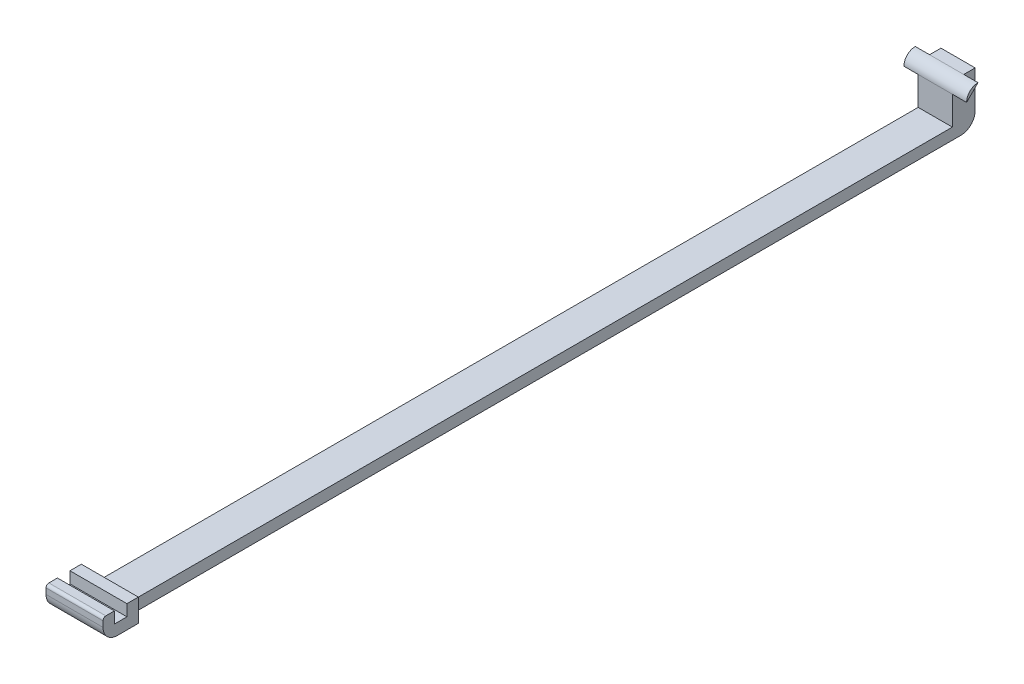
ISO-10303-21;
HEADER;
FILE_DESCRIPTION(('STEP AP214'),'2;1');
FILE_NAME('part.step','',(''),(''),'','','');
FILE_SCHEMA(('AUTOMOTIVE_DESIGN { 1 0 10303 214 1 1 1 1 }'));
ENDSEC;
DATA;
#1=APPLICATION_CONTEXT('core data for automotive mechanical design processes');
#2=APPLICATION_PROTOCOL_DEFINITION('international standard','automotive_design',2000,#1);
#3=PRODUCT_CONTEXT('',#1,'mechanical');
#4=PRODUCT('Part','Part','',(#3));
#5=PRODUCT_RELATED_PRODUCT_CATEGORY('part','',(#4));
#6=PRODUCT_DEFINITION_FORMATION('','',#4);
#7=PRODUCT_DEFINITION_CONTEXT('part definition',#1,'design');
#8=PRODUCT_DEFINITION('design','',#6,#7);
#9=PRODUCT_DEFINITION_SHAPE('','',#8);
#10=(LENGTH_UNIT() NAMED_UNIT(*) SI_UNIT(.MILLI.,.METRE.));
#11=(NAMED_UNIT(*) PLANE_ANGLE_UNIT() SI_UNIT($,.RADIAN.));
#12=(NAMED_UNIT(*) SI_UNIT($,.STERADIAN.) SOLID_ANGLE_UNIT());
#13=UNCERTAINTY_MEASURE_WITH_UNIT(LENGTH_MEASURE(1.E-05),#10,'distance_accuracy_value','');
#14=(GEOMETRIC_REPRESENTATION_CONTEXT(3) GLOBAL_UNCERTAINTY_ASSIGNED_CONTEXT((#13)) GLOBAL_UNIT_ASSIGNED_CONTEXT((#10,
#11,#12)) REPRESENTATION_CONTEXT('',''));
#15=CARTESIAN_POINT('',(0.,0.,0.));
#16=DIRECTION('',(0.,0.,1.));
#17=DIRECTION('',(1.,0.,0.));
#18=AXIS2_PLACEMENT_3D('',#15,#16,#17);
#19=CARTESIAN_POINT('',(-17.5,42.8284271247462,75.5));
#20=DIRECTION('',(0.,0.,1.));
#21=DIRECTION('',(1.,0.,0.));
#22=AXIS2_PLACEMENT_3D('',#19,#20,#21);
#23=PLANE('',#22);
#24=DIRECTION('',(0.,1.,0.));
#25=VECTOR('',#24,1.);
#26=CARTESIAN_POINT('',(5.00000000000003,42.8284271247462,75.5));
#27=LINE('',#26,#25);
#28=CARTESIAN_POINT('',(5.00000000000003,2.,75.5));
#29=VERTEX_POINT('',#28);
#30=CARTESIAN_POINT('',(5.00000000000003,4.,75.5));
#31=VERTEX_POINT('',#30);
#32=EDGE_CURVE('E338',#29,#31,#27,.T.);
#33=ORIENTED_EDGE('',*,*,#32,.F.);
#34=DIRECTION('',(-1.,0.,0.));
#35=VECTOR('',#34,1.);
#36=CARTESIAN_POINT('',(-17.5,2.,75.5));
#37=LINE('',#36,#35);
#38=CARTESIAN_POINT('',(-5.,2.,75.5));
#39=VERTEX_POINT('',#38);
#40=EDGE_CURVE('E369',#29,#39,#37,.T.);
#41=ORIENTED_EDGE('',*,*,#40,.T.);
#42=DIRECTION('',(0.,1.,0.));
#43=VECTOR('',#42,1.);
#44=CARTESIAN_POINT('',(-5.,42.8284271247462,75.5));
#45=LINE('',#44,#43);
#46=CARTESIAN_POINT('',(-5.,4.,75.5));
#47=VERTEX_POINT('',#46);
#48=EDGE_CURVE('E317',#39,#47,#45,.T.);
#49=ORIENTED_EDGE('',*,*,#48,.T.);
#50=DIRECTION('',(-1.,0.,0.));
#51=VECTOR('',#50,1.);
#52=CARTESIAN_POINT('',(-15.5,4.,75.5));
#53=LINE('',#52,#51);
#54=EDGE_CURVE('E362',#31,#47,#53,.T.);
#55=ORIENTED_EDGE('',*,*,#54,.F.);
#56=EDGE_LOOP('',(#33,#41,#49,#55));
#57=FACE_BOUND('',#56,.T.);
#58=ADVANCED_FACE('F84',(#57),#23,.F.);
#59=CARTESIAN_POINT('',(-17.5,42.8284271247462,73.3));
#60=DIRECTION('',(0.,0.,-1.));
#61=DIRECTION('',(-1.,0.,0.));
#62=AXIS2_PLACEMENT_3D('',#59,#60,#61);
#63=PLANE('',#62);
#64=DIRECTION('',(0.,-1.,0.));
#65=VECTOR('',#64,1.);
#66=CARTESIAN_POINT('',(5.00000000000003,42.8284271247462,73.3000000000001));
#67=LINE('',#66,#65);
#68=CARTESIAN_POINT('',(5.00000000000003,4.,73.3000000000001));
#69=VERTEX_POINT('',#68);
#70=CARTESIAN_POINT('',(5.00000000000003,2.,73.3));
#71=VERTEX_POINT('',#70);
#72=EDGE_CURVE('E103',#69,#71,#67,.T.);
#73=ORIENTED_EDGE('',*,*,#72,.F.);
#74=DIRECTION('',(1.,0.,0.));
#75=VECTOR('',#74,1.);
#76=CARTESIAN_POINT('',(-15.5,4.,73.3));
#77=LINE('',#76,#75);
#78=CARTESIAN_POINT('',(-5.,4.,73.3000000000001));
#79=VERTEX_POINT('',#78);
#80=EDGE_CURVE('E356',#79,#69,#77,.T.);
#81=ORIENTED_EDGE('',*,*,#80,.F.);
#82=DIRECTION('',(0.,-1.,0.));
#83=VECTOR('',#82,1.);
#84=CARTESIAN_POINT('',(-5.,42.8284271247462,73.3000000000001));
#85=LINE('',#84,#83);
#86=CARTESIAN_POINT('',(-5.,2.,73.3));
#87=VERTEX_POINT('',#86);
#88=EDGE_CURVE('E322',#79,#87,#85,.T.);
#89=ORIENTED_EDGE('',*,*,#88,.T.);
#90=DIRECTION('',(1.,0.,0.));
#91=VECTOR('',#90,1.);
#92=CARTESIAN_POINT('',(-17.5,2.,73.3));
#93=LINE('',#92,#91);
#94=EDGE_CURVE('E365',#87,#71,#93,.T.);
#95=ORIENTED_EDGE('',*,*,#94,.T.);
#96=EDGE_LOOP('',(#73,#81,#89,#95));
#97=FACE_BOUND('',#96,.T.);
#98=ADVANCED_FACE('F452',(#97),#63,.F.);
#99=CARTESIAN_POINT('',(0.,2.,0.));
#100=DIRECTION('',(0.,1.,0.));
#101=DIRECTION('',(0.,0.,1.));
#102=AXIS2_PLACEMENT_3D('',#99,#100,#101);
#103=PLANE('',#102);
#104=ORIENTED_EDGE('',*,*,#40,.F.);
#105=DIRECTION('',(0.,0.,-1.));
#106=VECTOR('',#105,1.);
#107=CARTESIAN_POINT('',(5.00000000000001,2.,0.));
#108=LINE('',#107,#106);
#109=EDGE_CURVE('E340',#29,#71,#108,.T.);
#110=ORIENTED_EDGE('',*,*,#109,.T.);
#111=ORIENTED_EDGE('',*,*,#94,.F.);
#112=DIRECTION('',(0.,0.,-1.));
#113=VECTOR('',#112,1.);
#114=CARTESIAN_POINT('',(-5.,2.,0.));
#115=LINE('',#114,#113);
#116=EDGE_CURVE('E320',#39,#87,#115,.T.);
#117=ORIENTED_EDGE('',*,*,#116,.F.);
#118=EDGE_LOOP('',(#104,#110,#111,#117));
#119=FACE_BOUND('',#118,.T.);
#120=ADVANCED_FACE('F449',(#119),#103,.T.);
#121=CARTESIAN_POINT('',(0.,4.,0.));
#122=DIRECTION('',(0.,-1.,0.));
#123=DIRECTION('',(0.,0.,-1.));
#124=AXIS2_PLACEMENT_3D('',#121,#122,#123);
#125=PLANE('',#124);
#126=DIRECTION('',(0.,0.,1.));
#127=VECTOR('',#126,1.);
#128=CARTESIAN_POINT('',(5.00000000000001,4.,0.));
#129=LINE('',#128,#127);
#130=CARTESIAN_POINT('',(5.00000000000003,4.,71.3));
#131=VERTEX_POINT('',#130);
#132=EDGE_CURVE('E99',#131,#69,#129,.T.);
#133=ORIENTED_EDGE('',*,*,#132,.F.);
#134=DIRECTION('',(-1.,0.,0.));
#135=VECTOR('',#134,1.);
#136=CARTESIAN_POINT('',(-15.5,4.,71.3));
#137=LINE('',#136,#135);
#138=CARTESIAN_POINT('',(-5.,4.,71.3));
#139=VERTEX_POINT('',#138);
#140=EDGE_CURVE('E359',#131,#139,#137,.T.);
#141=ORIENTED_EDGE('',*,*,#140,.T.);
#142=DIRECTION('',(0.,0.,1.));
#143=VECTOR('',#142,1.);
#144=CARTESIAN_POINT('',(-5.,4.,0.));
#145=LINE('',#144,#143);
#146=EDGE_CURVE('E325',#139,#79,#145,.T.);
#147=ORIENTED_EDGE('',*,*,#146,.T.);
#148=ORIENTED_EDGE('',*,*,#80,.T.);
#149=EDGE_LOOP('',(#133,#141,#147,#148));
#150=FACE_BOUND('',#149,.T.);
#151=ADVANCED_FACE('F403',(#150),#125,.F.);
#152=DIRECTION('',(0.,0.,1.));
#153=VECTOR('',#152,1.);
#154=CARTESIAN_POINT('',(5.00000000000001,4.,0.));
#155=LINE('',#154,#153);
#156=CARTESIAN_POINT('',(5.00000000000003,4.,77.));
#157=VERTEX_POINT('',#156);
#158=EDGE_CURVE('E336',#31,#157,#155,.T.);
#159=ORIENTED_EDGE('',*,*,#158,.F.);
#160=ORIENTED_EDGE('',*,*,#54,.T.);
#161=DIRECTION('',(0.,0.,1.));
#162=VECTOR('',#161,1.);
#163=CARTESIAN_POINT('',(-5.,4.,0.));
#164=LINE('',#163,#162);
#165=CARTESIAN_POINT('',(-5.,4.,77.));
#166=VERTEX_POINT('',#165);
#167=EDGE_CURVE('E314',#47,#166,#164,.T.);
#168=ORIENTED_EDGE('',*,*,#167,.T.);
#169=DIRECTION('',(1.,0.,0.));
#170=VECTOR('',#169,1.);
#171=CARTESIAN_POINT('',(0.,4.,77.));
#172=LINE('',#171,#170);
#173=EDGE_CURVE('E390',#166,#157,#172,.T.);
#174=ORIENTED_EDGE('',*,*,#173,.T.);
#175=EDGE_LOOP('',(#159,#160,#168,#174));
#176=FACE_BOUND('',#175,.T.);
#177=ADVANCED_FACE('F442',(#176),#125,.F.);
#178=CARTESIAN_POINT('',(-19.5,2.,77.5));
#179=DIRECTION('',(0.,0.,-1.));
#180=DIRECTION('',(-1.,0.,0.));
#181=AXIS2_PLACEMENT_3D('',#178,#179,#180);
#182=PLANE('',#181);
#183=DIRECTION('',(0.,-1.,0.));
#184=VECTOR('',#183,1.);
#185=CARTESIAN_POINT('',(5.00000000000003,9.,77.5));
#186=LINE('',#185,#184);
#187=CARTESIAN_POINT('',(5.00000000000003,3.5,77.5));
#188=VERTEX_POINT('',#187);
#189=CARTESIAN_POINT('',(5.00000000000003,2.5,77.5));
#190=VERTEX_POINT('',#189);
#191=EDGE_CURVE('E277',#188,#190,#186,.T.);
#192=ORIENTED_EDGE('',*,*,#191,.F.);
#193=DIRECTION('',(1.,0.,0.));
#194=VECTOR('',#193,1.);
#195=CARTESIAN_POINT('',(-19.5,3.5,77.5));
#196=LINE('',#195,#194);
#197=CARTESIAN_POINT('',(-5.,3.5,77.5));
#198=VERTEX_POINT('',#197);
#199=EDGE_CURVE('E387',#188,#198,#196,.F.);
#200=ORIENTED_EDGE('',*,*,#199,.T.);
#201=DIRECTION('',(0.,-1.,0.));
#202=VECTOR('',#201,1.);
#203=CARTESIAN_POINT('',(-5.,9.,77.5));
#204=LINE('',#203,#202);
#205=CARTESIAN_POINT('',(-5.,2.5,77.5));
#206=VERTEX_POINT('',#205);
#207=EDGE_CURVE('E267',#198,#206,#204,.T.);
#208=ORIENTED_EDGE('',*,*,#207,.T.);
#209=DIRECTION('',(1.,0.,0.));
#210=VECTOR('',#209,1.);
#211=CARTESIAN_POINT('',(-19.5,2.5,77.5));
#212=LINE('',#211,#210);
#213=EDGE_CURVE('E374',#206,#190,#212,.T.);
#214=ORIENTED_EDGE('',*,*,#213,.T.);
#215=EDGE_LOOP('',(#192,#200,#208,#214));
#216=FACE_BOUND('',#215,.T.);
#217=ADVANCED_FACE('F435',(#216),#182,.F.);
#218=CARTESIAN_POINT('',(0.,0.,0.));
#219=DIRECTION('',(0.,1.,0.));
#220=DIRECTION('',(0.,0.,1.));
#221=AXIS2_PLACEMENT_3D('',#218,#219,#220);
#222=PLANE('',#221);
#223=DIRECTION('',(0.,0.,1.));
#224=VECTOR('',#223,1.);
#225=CARTESIAN_POINT('',(5.00000000000001,0.,0.));
#226=LINE('',#225,#224);
#227=CARTESIAN_POINT('',(5.00000000000003,0.,71.3));
#228=VERTEX_POINT('',#227);
#229=CARTESIAN_POINT('',(5.00000000000003,0.,75.));
#230=VERTEX_POINT('',#229);
#231=EDGE_CURVE('E263',#228,#230,#226,.T.);
#232=ORIENTED_EDGE('',*,*,#231,.T.);
#233=DIRECTION('',(1.,0.,0.));
#234=VECTOR('',#233,1.);
#235=CARTESIAN_POINT('',(0.,0.,75.));
#236=LINE('',#235,#234);
#237=CARTESIAN_POINT('',(-5.,0.,75.));
#238=VERTEX_POINT('',#237);
#239=EDGE_CURVE('E380',#230,#238,#236,.F.);
#240=ORIENTED_EDGE('',*,*,#239,.T.);
#241=DIRECTION('',(0.,0.,1.));
#242=VECTOR('',#241,1.);
#243=CARTESIAN_POINT('',(-5.,0.,0.));
#244=LINE('',#243,#242);
#245=CARTESIAN_POINT('',(-5.,0.,71.3));
#246=VERTEX_POINT('',#245);
#247=EDGE_CURVE('E257',#246,#238,#244,.T.);
#248=ORIENTED_EDGE('',*,*,#247,.F.);
#249=DIRECTION('',(-0.894427190999885,0.,0.447213595500019));
#250=VECTOR('',#249,1.);
#251=CARTESIAN_POINT('',(27.5200000000026,0.,55.0399999999959));
#252=LINE('',#251,#250);
#253=CARTESIAN_POINT('',(-3.00000000000004,0.,70.2999999999999));
#254=VERTEX_POINT('',#253);
#255=EDGE_CURVE('E286',#254,#246,#252,.T.);
#256=ORIENTED_EDGE('',*,*,#255,.F.);
#257=DIRECTION('',(0.,0.,1.));
#258=VECTOR('',#257,1.);
#259=CARTESIAN_POINT('',(-3.00000000000004,0.,0.));
#260=LINE('',#259,#258);
#261=CARTESIAN_POINT('',(-3.00000000000004,0.,-75.));
#262=VERTEX_POINT('',#261);
#263=EDGE_CURVE('E284',#262,#254,#260,.T.);
#264=ORIENTED_EDGE('',*,*,#263,.F.);
#265=DIRECTION('',(-1.,0.,0.));
#266=VECTOR('',#265,1.);
#267=CARTESIAN_POINT('',(0.,0.,-75.));
#268=LINE('',#267,#266);
#269=CARTESIAN_POINT('',(3.00000000000004,0.,-75.));
#270=VERTEX_POINT('',#269);
#271=EDGE_CURVE('E383',#262,#270,#268,.F.);
#272=ORIENTED_EDGE('',*,*,#271,.T.);
#273=DIRECTION('',(0.,0.,-1.));
#274=VECTOR('',#273,1.);
#275=CARTESIAN_POINT('',(3.00000000000003,0.,0.));
#276=LINE('',#275,#274);
#277=CARTESIAN_POINT('',(3.00000000000001,0.,70.2999999999999));
#278=VERTEX_POINT('',#277);
#279=EDGE_CURVE('E266',#278,#270,#276,.T.);
#280=ORIENTED_EDGE('',*,*,#279,.F.);
#281=DIRECTION('',(0.894427190999892,0.,0.447213595500005));
#282=VECTOR('',#281,1.);
#283=CARTESIAN_POINT('',(-27.520000000002,0.,55.0399999999968));
#284=LINE('',#283,#282);
#285=EDGE_CURVE('E262',#278,#228,#284,.T.);
#286=ORIENTED_EDGE('',*,*,#285,.T.);
#287=EDGE_LOOP('',(#232,#240,#248,#256,#264,#272,#280,#286));
#288=FACE_BOUND('',#287,.T.);
#289=ADVANCED_FACE('F427',(#288),#222,.F.);
#290=CARTESIAN_POINT('',(-19.5,2.5,75.));
#291=DIRECTION('',(1.,0.,0.));
#292=DIRECTION('',(0.,0.,-1.));
#293=AXIS2_PLACEMENT_3D('',#290,#291,#292);
#294=CYLINDRICAL_SURFACE('',#293,2.5);
#295=ORIENTED_EDGE('',*,*,#239,.F.);
#296=CARTESIAN_POINT('',(5.00000000000003,2.5,75.));
#297=DIRECTION('',(1.,0.,0.));
#298=DIRECTION('',(0.,0.,-1.));
#299=AXIS2_PLACEMENT_3D('',#296,#297,#298);
#300=CIRCLE('',#299,2.5);
#301=EDGE_CURVE('E344',#230,#190,#300,.F.);
#302=ORIENTED_EDGE('',*,*,#301,.T.);
#303=ORIENTED_EDGE('',*,*,#213,.F.);
#304=CARTESIAN_POINT('',(-5.,2.5,75.));
#305=DIRECTION('',(1.,0.,0.));
#306=DIRECTION('',(0.,0.,-1.));
#307=AXIS2_PLACEMENT_3D('',#304,#305,#306);
#308=CIRCLE('',#307,2.5);
#309=EDGE_CURVE('E328',#238,#206,#308,.F.);
#310=ORIENTED_EDGE('',*,*,#309,.F.);
#311=EDGE_LOOP('',(#295,#302,#303,#310));
#312=FACE_BOUND('',#311,.T.);
#313=ADVANCED_FACE('F432',(#312),#294,.T.);
#314=CARTESIAN_POINT('',(0.,3.5,77.));
#315=DIRECTION('',(1.,0.,0.));
#316=DIRECTION('',(0.,0.,-1.));
#317=AXIS2_PLACEMENT_3D('',#314,#315,#316);
#318=CYLINDRICAL_SURFACE('',#317,0.5);
#319=ORIENTED_EDGE('',*,*,#199,.F.);
#320=CARTESIAN_POINT('',(5.00000000000003,3.5,77.));
#321=DIRECTION('',(1.,0.,0.));
#322=DIRECTION('',(0.,0.,-1.));
#323=AXIS2_PLACEMENT_3D('',#320,#321,#322);
#324=CIRCLE('',#323,0.5);
#325=EDGE_CURVE('E333',#188,#157,#324,.F.);
#326=ORIENTED_EDGE('',*,*,#325,.T.);
#327=ORIENTED_EDGE('',*,*,#173,.F.);
#328=CARTESIAN_POINT('',(-5.,3.5,77.));
#329=DIRECTION('',(1.,0.,0.));
#330=DIRECTION('',(0.,0.,-1.));
#331=AXIS2_PLACEMENT_3D('',#328,#329,#330);
#332=CIRCLE('',#331,0.5);
#333=EDGE_CURVE('E312',#198,#166,#332,.F.);
#334=ORIENTED_EDGE('',*,*,#333,.F.);
#335=EDGE_LOOP('',(#319,#326,#327,#334));
#336=FACE_BOUND('',#335,.T.);
#337=ADVANCED_FACE('F86',(#336),#318,.T.);
#338=CARTESIAN_POINT('',(-17.5,42.8284271247462,71.3));
#339=DIRECTION('',(0.,0.,1.));
#340=DIRECTION('',(1.,0.,0.));
#341=AXIS2_PLACEMENT_3D('',#338,#339,#340);
#342=PLANE('',#341);
#343=DIRECTION('',(0.,1.,0.));
#344=VECTOR('',#343,1.);
#345=CARTESIAN_POINT('',(5.00000000000003,42.8284271247462,71.3));
#346=LINE('',#345,#344);
#347=CARTESIAN_POINT('',(5.00000000000003,2.,71.3));
#348=VERTEX_POINT('',#347);
#349=EDGE_CURVE('E92',#348,#131,#346,.T.);
#350=ORIENTED_EDGE('',*,*,#349,.F.);
#351=DIRECTION('',(-1.,0.,0.));
#352=VECTOR('',#351,1.);
#353=CARTESIAN_POINT('',(-17.5,2.,71.3));
#354=LINE('',#353,#352);
#355=CARTESIAN_POINT('',(-5.,2.,71.3));
#356=VERTEX_POINT('',#355);
#357=EDGE_CURVE('E366',#348,#356,#354,.T.);
#358=ORIENTED_EDGE('',*,*,#357,.T.);
#359=DIRECTION('',(0.,1.,0.));
#360=VECTOR('',#359,1.);
#361=CARTESIAN_POINT('',(-5.,42.8284271247462,71.3));
#362=LINE('',#361,#360);
#363=EDGE_CURVE('E393',#356,#139,#362,.T.);
#364=ORIENTED_EDGE('',*,*,#363,.T.);
#365=ORIENTED_EDGE('',*,*,#140,.F.);
#366=EDGE_LOOP('',(#350,#358,#364,#365));
#367=FACE_BOUND('',#366,.T.);
#368=ADVANCED_FACE('F405',(#367),#342,.F.);
#369=CARTESIAN_POINT('',(-19.5,9.,0.));
#370=DIRECTION('',(0.,-1.,0.));
#371=DIRECTION('',(0.,0.,-1.));
#372=AXIS2_PLACEMENT_3D('',#369,#370,#371);
#373=PLANE('',#372);
#374=DIRECTION('',(-1.,0.,0.));
#375=VECTOR('',#374,1.);
#376=CARTESIAN_POINT('',(-18.25,9.,-75.5));
#377=LINE('',#376,#375);
#378=CARTESIAN_POINT('',(3.00000000000004,9.,-75.5));
#379=VERTEX_POINT('',#378);
#380=CARTESIAN_POINT('',(-3.00000000000004,9.,-75.5));
#381=VERTEX_POINT('',#380);
#382=EDGE_CURVE('E350',#379,#381,#377,.T.);
#383=ORIENTED_EDGE('',*,*,#382,.F.);
#384=DIRECTION('',(0.,0.,-1.));
#385=VECTOR('',#384,1.);
#386=CARTESIAN_POINT('',(3.00000000000003,9.,0.));
#387=LINE('',#386,#385);
#388=CARTESIAN_POINT('',(3.00000000000004,9.,-77.5));
#389=VERTEX_POINT('',#388);
#390=EDGE_CURVE('E258',#379,#389,#387,.T.);
#391=ORIENTED_EDGE('',*,*,#390,.T.);
#392=DIRECTION('',(1.,0.,0.));
#393=VECTOR('',#392,1.);
#394=CARTESIAN_POINT('',(-19.5,9.,-77.5));
#395=LINE('',#394,#393);
#396=CARTESIAN_POINT('',(-3.00000000000004,9.,-77.5));
#397=VERTEX_POINT('',#396);
#398=EDGE_CURVE('E347',#397,#389,#395,.T.);
#399=ORIENTED_EDGE('',*,*,#398,.F.);
#400=DIRECTION('',(0.,0.,1.));
#401=VECTOR('',#400,1.);
#402=CARTESIAN_POINT('',(-3.00000000000004,9.,0.));
#403=LINE('',#402,#401);
#404=EDGE_CURVE('E280',#397,#381,#403,.T.);
#405=ORIENTED_EDGE('',*,*,#404,.T.);
#406=EDGE_LOOP('',(#383,#391,#399,#405));
#407=FACE_BOUND('',#406,.T.);
#408=ADVANCED_FACE('F492',(#407),#373,.F.);
#409=DIRECTION('',(0.,0.,1.));
#410=VECTOR('',#409,1.);
#411=CARTESIAN_POINT('',(3.00000000000003,2.,0.));
#412=LINE('',#411,#410);
#413=CARTESIAN_POINT('',(3.00000000000004,2.,-73.5));
#414=VERTEX_POINT('',#413);
#415=CARTESIAN_POINT('',(3.00000000000001,2.,70.2999999999999));
#416=VERTEX_POINT('',#415);
#417=EDGE_CURVE('E306',#414,#416,#412,.T.);
#418=ORIENTED_EDGE('',*,*,#417,.F.);
#419=DIRECTION('',(1.,0.,0.));
#420=VECTOR('',#419,1.);
#421=CARTESIAN_POINT('',(0.,2.,-73.5));
#422=LINE('',#421,#420);
#423=CARTESIAN_POINT('',(-3.00000000000004,2.,-73.5));
#424=VERTEX_POINT('',#423);
#425=EDGE_CURVE('E353',#424,#414,#422,.T.);
#426=ORIENTED_EDGE('',*,*,#425,.F.);
#427=DIRECTION('',(0.,0.,-1.));
#428=VECTOR('',#427,1.);
#429=CARTESIAN_POINT('',(-3.00000000000004,2.,0.));
#430=LINE('',#429,#428);
#431=CARTESIAN_POINT('',(-3.00000000000004,2.,70.2999999999999));
#432=VERTEX_POINT('',#431);
#433=EDGE_CURVE('E300',#432,#424,#430,.T.);
#434=ORIENTED_EDGE('',*,*,#433,.F.);
#435=DIRECTION('',(0.894427190999885,0.,-0.447213595500019));
#436=VECTOR('',#435,1.);
#437=CARTESIAN_POINT('',(27.5200000000026,2.,55.0399999999959));
#438=LINE('',#437,#436);
#439=EDGE_CURVE('E310',#356,#432,#438,.T.);
#440=ORIENTED_EDGE('',*,*,#439,.F.);
#441=ORIENTED_EDGE('',*,*,#357,.F.);
#442=DIRECTION('',(-0.894427190999892,0.,-0.447213595500005));
#443=VECTOR('',#442,1.);
#444=CARTESIAN_POINT('',(-27.520000000002,2.,55.0399999999968));
#445=LINE('',#444,#443);
#446=EDGE_CURVE('E330',#348,#416,#445,.T.);
#447=ORIENTED_EDGE('',*,*,#446,.T.);
#448=EDGE_LOOP('',(#418,#426,#434,#440,#441,#447));
#449=FACE_BOUND('',#448,.T.);
#450=ADVANCED_FACE('F413',(#449),#103,.T.);
#451=CARTESIAN_POINT('',(0.,0.,-73.5));
#452=DIRECTION('',(0.,0.,1.));
#453=DIRECTION('',(1.,0.,0.));
#454=AXIS2_PLACEMENT_3D('',#451,#452,#453);
#455=PLANE('',#454);
#456=DIRECTION('',(0.,-1.,0.));
#457=VECTOR('',#456,1.);
#458=CARTESIAN_POINT('',(3.00000000000004,0.,-73.5));
#459=LINE('',#458,#457);
#460=CARTESIAN_POINT('',(3.00000000000004,7.,-73.5));
#461=VERTEX_POINT('',#460);
#462=EDGE_CURVE('E304',#461,#414,#459,.T.);
#463=ORIENTED_EDGE('',*,*,#462,.F.);
#464=DIRECTION('',(-1.,0.,0.));
#465=VECTOR('',#464,1.);
#466=CARTESIAN_POINT('',(-17.4494897427832,7.,-73.5));
#467=LINE('',#466,#465);
#468=CARTESIAN_POINT('',(-3.00000000000004,7.,-73.5));
#469=VERTEX_POINT('',#468);
#470=EDGE_CURVE('E233',#461,#469,#467,.T.);
#471=ORIENTED_EDGE('',*,*,#470,.T.);
#472=DIRECTION('',(0.,1.,0.));
#473=VECTOR('',#472,1.);
#474=CARTESIAN_POINT('',(-3.00000000000004,0.,-73.5));
#475=LINE('',#474,#473);
#476=EDGE_CURVE('E279',#424,#469,#475,.T.);
#477=ORIENTED_EDGE('',*,*,#476,.F.);
#478=ORIENTED_EDGE('',*,*,#425,.T.);
#479=EDGE_LOOP('',(#463,#471,#477,#478));
#480=FACE_BOUND('',#479,.T.);
#481=ADVANCED_FACE('F472',(#480),#455,.T.);
#482=CARTESIAN_POINT('',(-19.5,2.,-77.5));
#483=DIRECTION('',(0.,0.,1.));
#484=DIRECTION('',(1.,0.,0.));
#485=AXIS2_PLACEMENT_3D('',#482,#483,#484);
#486=PLANE('',#485);
#487=ORIENTED_EDGE('',*,*,#398,.T.);
#488=DIRECTION('',(0.,-1.,0.));
#489=VECTOR('',#488,1.);
#490=CARTESIAN_POINT('',(3.00000000000004,9.,-77.5));
#491=LINE('',#490,#489);
#492=CARTESIAN_POINT('',(3.00000000000004,2.5,-77.5));
#493=VERTEX_POINT('',#492);
#494=EDGE_CURVE('E274',#389,#493,#491,.T.);
#495=ORIENTED_EDGE('',*,*,#494,.T.);
#496=DIRECTION('',(-1.,0.,0.));
#497=VECTOR('',#496,1.);
#498=CARTESIAN_POINT('',(-19.5,2.5,-77.5));
#499=LINE('',#498,#497);
#500=CARTESIAN_POINT('',(-3.00000000000004,2.5,-77.5));
#501=VERTEX_POINT('',#500);
#502=EDGE_CURVE('E377',#493,#501,#499,.T.);
#503=ORIENTED_EDGE('',*,*,#502,.T.);
#504=DIRECTION('',(0.,-1.,0.));
#505=VECTOR('',#504,1.);
#506=CARTESIAN_POINT('',(-3.00000000000004,9.,-77.5));
#507=LINE('',#506,#505);
#508=EDGE_CURVE('E283',#397,#501,#507,.T.);
#509=ORIENTED_EDGE('',*,*,#508,.F.);
#510=EDGE_LOOP('',(#487,#495,#503,#509));
#511=FACE_BOUND('',#510,.T.);
#512=ADVANCED_FACE('F468',(#511),#486,.F.);
#513=CARTESIAN_POINT('',(-19.5,2.5,-75.));
#514=DIRECTION('',(-1.,0.,0.));
#515=DIRECTION('',(0.,0.,1.));
#516=AXIS2_PLACEMENT_3D('',#513,#514,#515);
#517=CYLINDRICAL_SURFACE('',#516,2.5);
#518=CARTESIAN_POINT('',(3.00000000000004,2.5,-75.));
#519=DIRECTION('',(-1.,0.,0.));
#520=DIRECTION('',(0.,0.,1.));
#521=AXIS2_PLACEMENT_3D('',#518,#519,#520);
#522=CIRCLE('',#521,2.5);
#523=EDGE_CURVE('E308',#270,#493,#522,.F.);
#524=ORIENTED_EDGE('',*,*,#523,.F.);
#525=ORIENTED_EDGE('',*,*,#271,.F.);
#526=CARTESIAN_POINT('',(-3.00000000000004,2.5,-75.));
#527=DIRECTION('',(1.,0.,0.));
#528=DIRECTION('',(0.,0.,-1.));
#529=AXIS2_PLACEMENT_3D('',#526,#527,#528);
#530=CIRCLE('',#529,2.5);
#531=EDGE_CURVE('E302',#501,#262,#530,.F.);
#532=ORIENTED_EDGE('',*,*,#531,.F.);
#533=ORIENTED_EDGE('',*,*,#502,.F.);
#534=EDGE_LOOP('',(#524,#525,#532,#533));
#535=FACE_BOUND('',#534,.T.);
#536=ADVANCED_FACE('F471',(#535),#517,.T.);
#537=CARTESIAN_POINT('',(0.,7.,-75.5));
#538=DIRECTION('',(1.,0.,0.));
#539=DIRECTION('',(0.,0.,-1.));
#540=AXIS2_PLACEMENT_3D('',#537,#538,#539);
#541=CYLINDRICAL_SURFACE('',#540,2.);
#542=ORIENTED_EDGE('',*,*,#470,.F.);
#543=DIRECTION('',(1.,0.,0.));
#544=VECTOR('',#543,1.);
#545=CARTESIAN_POINT('',(-5.5,7.,-73.5));
#546=LINE('',#545,#544);
#547=CARTESIAN_POINT('',(5.5,7.,-73.5));
#548=VERTEX_POINT('',#547);
#549=EDGE_CURVE('E225',#461,#548,#546,.T.);
#550=ORIENTED_EDGE('',*,*,#549,.T.);
#551=CARTESIAN_POINT('',(5.5,7.,-75.5));
#552=DIRECTION('',(1.,0.,0.));
#553=DIRECTION('',(0.,0.,1.));
#554=AXIS2_PLACEMENT_3D('',#551,#552,#553);
#555=CIRCLE('',#554,2.);
#556=CARTESIAN_POINT('',(5.5,9.,-75.5));
#557=VERTEX_POINT('',#556);
#558=EDGE_CURVE('E230',#557,#548,#555,.T.);
#559=ORIENTED_EDGE('',*,*,#558,.F.);
#560=DIRECTION('',(1.,0.,0.));
#561=VECTOR('',#560,1.);
#562=CARTESIAN_POINT('',(-5.5,9.,-75.5));
#563=LINE('',#562,#561);
#564=EDGE_CURVE('E241',#379,#557,#563,.T.);
#565=ORIENTED_EDGE('',*,*,#564,.F.);
#566=ORIENTED_EDGE('',*,*,#382,.T.);
#567=CARTESIAN_POINT('',(-5.5,9.,-75.5));
#568=VERTEX_POINT('',#567);
#569=EDGE_CURVE('E252',#568,#381,#563,.T.);
#570=ORIENTED_EDGE('',*,*,#569,.F.);
#571=CARTESIAN_POINT('',(-5.5,7.,-75.5));
#572=DIRECTION('',(1.,0.,0.));
#573=DIRECTION('',(0.,0.,1.));
#574=AXIS2_PLACEMENT_3D('',#571,#572,#573);
#575=CIRCLE('',#574,2.);
#576=CARTESIAN_POINT('',(-5.5,7.,-73.5));
#577=VERTEX_POINT('',#576);
#578=EDGE_CURVE('E243',#568,#577,#575,.T.);
#579=ORIENTED_EDGE('',*,*,#578,.T.);
#580=EDGE_CURVE('E235',#577,#469,#546,.T.);
#581=ORIENTED_EDGE('',*,*,#580,.T.);
#582=EDGE_LOOP('',(#542,#550,#559,#565,#566,#570,#579,#581));
#583=FACE_BOUND('',#582,.T.);
#584=ADVANCED_FACE('F227',(#583),#541,.T.);
#585=CARTESIAN_POINT('',(-5.,9.,0.));
#586=DIRECTION('',(1.,0.,0.));
#587=DIRECTION('',(0.,0.,-1.));
#588=AXIS2_PLACEMENT_3D('',#585,#586,#587);
#589=PLANE('',#588);
#590=ORIENTED_EDGE('',*,*,#309,.T.);
#591=ORIENTED_EDGE('',*,*,#207,.F.);
#592=ORIENTED_EDGE('',*,*,#333,.T.);
#593=ORIENTED_EDGE('',*,*,#167,.F.);
#594=ORIENTED_EDGE('',*,*,#48,.F.);
#595=ORIENTED_EDGE('',*,*,#116,.T.);
#596=ORIENTED_EDGE('',*,*,#88,.F.);
#597=ORIENTED_EDGE('',*,*,#146,.F.);
#598=ORIENTED_EDGE('',*,*,#363,.F.);
#599=DIRECTION('',(0.,-1.,0.));
#600=VECTOR('',#599,1.);
#601=CARTESIAN_POINT('',(-5.,9.,71.3));
#602=LINE('',#601,#600);
#603=EDGE_CURVE('E294',#356,#246,#602,.T.);
#604=ORIENTED_EDGE('',*,*,#603,.T.);
#605=ORIENTED_EDGE('',*,*,#247,.T.);
#606=EDGE_LOOP('',(#590,#591,#592,#593,#594,#595,#596,#597,#598,#604,#605));
#607=FACE_BOUND('',#606,.T.);
#608=ADVANCED_FACE('F409',(#607),#589,.F.);
#609=CARTESIAN_POINT('',(27.5200000000026,9.,55.0399999999959));
#610=DIRECTION('',(0.447213595500019,0.,0.894427190999885));
#611=DIRECTION('',(0.894427190999885,0.,-0.447213595500019));
#612=AXIS2_PLACEMENT_3D('',#609,#610,#611);
#613=PLANE('',#612);
#614=ORIENTED_EDGE('',*,*,#439,.T.);
#615=DIRECTION('',(0.,-1.,0.));
#616=VECTOR('',#615,1.);
#617=CARTESIAN_POINT('',(-3.00000000000004,9.,70.2999999999999));
#618=LINE('',#617,#616);
#619=EDGE_CURVE('E292',#432,#254,#618,.T.);
#620=ORIENTED_EDGE('',*,*,#619,.T.);
#621=ORIENTED_EDGE('',*,*,#255,.T.);
#622=ORIENTED_EDGE('',*,*,#603,.F.);
#623=EDGE_LOOP('',(#614,#620,#621,#622));
#624=FACE_BOUND('',#623,.T.);
#625=ADVANCED_FACE('F417',(#624),#613,.F.);
#626=CARTESIAN_POINT('',(-3.00000000000004,9.,0.));
#627=DIRECTION('',(1.,0.,0.));
#628=DIRECTION('',(0.,0.,-1.));
#629=AXIS2_PLACEMENT_3D('',#626,#627,#628);
#630=PLANE('',#629);
#631=ORIENTED_EDGE('',*,*,#476,.T.);
#632=DIRECTION('',(0.,0.707106781186547,-0.707106781186548));
#633=VECTOR('',#632,1.);
#634=CARTESIAN_POINT('',(-3.00000000000004,-28.75,-37.75));
#635=LINE('',#634,#633);
#636=EDGE_CURVE('E253',#469,#381,#635,.T.);
#637=ORIENTED_EDGE('',*,*,#636,.T.);
#638=ORIENTED_EDGE('',*,*,#404,.F.);
#639=ORIENTED_EDGE('',*,*,#508,.T.);
#640=ORIENTED_EDGE('',*,*,#531,.T.);
#641=ORIENTED_EDGE('',*,*,#263,.T.);
#642=ORIENTED_EDGE('',*,*,#619,.F.);
#643=ORIENTED_EDGE('',*,*,#433,.T.);
#644=EDGE_LOOP('',(#631,#637,#638,#639,#640,#641,#642,#643));
#645=FACE_BOUND('',#644,.T.);
#646=ADVANCED_FACE('F419',(#645),#630,.F.);
#647=CARTESIAN_POINT('',(5.00000000000001,9.,0.));
#648=DIRECTION('',(1.,0.,0.));
#649=DIRECTION('',(0.,0.,-1.));
#650=AXIS2_PLACEMENT_3D('',#647,#648,#649);
#651=PLANE('',#650);
#652=ORIENTED_EDGE('',*,*,#231,.F.);
#653=DIRECTION('',(0.,-1.,0.));
#654=VECTOR('',#653,1.);
#655=CARTESIAN_POINT('',(5.00000000000003,9.,71.3));
#656=LINE('',#655,#654);
#657=EDGE_CURVE('E261',#348,#228,#656,.T.);
#658=ORIENTED_EDGE('',*,*,#657,.F.);
#659=ORIENTED_EDGE('',*,*,#349,.T.);
#660=ORIENTED_EDGE('',*,*,#132,.T.);
#661=ORIENTED_EDGE('',*,*,#72,.T.);
#662=ORIENTED_EDGE('',*,*,#109,.F.);
#663=ORIENTED_EDGE('',*,*,#32,.T.);
#664=ORIENTED_EDGE('',*,*,#158,.T.);
#665=ORIENTED_EDGE('',*,*,#325,.F.);
#666=ORIENTED_EDGE('',*,*,#191,.T.);
#667=ORIENTED_EDGE('',*,*,#301,.F.);
#668=EDGE_LOOP('',(#652,#658,#659,#660,#661,#662,#663,#664,#665,#666,#667));
#669=FACE_BOUND('',#668,.T.);
#670=ADVANCED_FACE('F398',(#669),#651,.T.);
#671=CARTESIAN_POINT('',(3.00000000000003,9.,0.));
#672=DIRECTION('',(-1.,0.,0.));
#673=DIRECTION('',(0.,0.,1.));
#674=AXIS2_PLACEMENT_3D('',#671,#672,#673);
#675=PLANE('',#674);
#676=ORIENTED_EDGE('',*,*,#390,.F.);
#677=DIRECTION('',(0.,-0.707106781186547,0.707106781186548));
#678=VECTOR('',#677,1.);
#679=CARTESIAN_POINT('',(3.00000000000003,-28.75,-37.75));
#680=LINE('',#679,#678);
#681=EDGE_CURVE('E12',#379,#461,#680,.T.);
#682=ORIENTED_EDGE('',*,*,#681,.T.);
#683=ORIENTED_EDGE('',*,*,#462,.T.);
#684=ORIENTED_EDGE('',*,*,#417,.T.);
#685=DIRECTION('',(0.,-1.,0.));
#686=VECTOR('',#685,1.);
#687=CARTESIAN_POINT('',(3.00000000000001,9.,70.2999999999999));
#688=LINE('',#687,#686);
#689=EDGE_CURVE('E272',#416,#278,#688,.T.);
#690=ORIENTED_EDGE('',*,*,#689,.T.);
#691=ORIENTED_EDGE('',*,*,#279,.T.);
#692=ORIENTED_EDGE('',*,*,#523,.T.);
#693=ORIENTED_EDGE('',*,*,#494,.F.);
#694=EDGE_LOOP('',(#676,#682,#683,#684,#690,#691,#692,#693));
#695=FACE_BOUND('',#694,.T.);
#696=ADVANCED_FACE('F566',(#695),#675,.F.);
#697=CARTESIAN_POINT('',(-27.520000000002,9.,55.0399999999968));
#698=DIRECTION('',(0.447213595500005,0.,-0.894427190999892));
#699=DIRECTION('',(-0.894427190999892,0.,-0.447213595500005));
#700=AXIS2_PLACEMENT_3D('',#697,#698,#699);
#701=PLANE('',#700);
#702=ORIENTED_EDGE('',*,*,#657,.T.);
#703=ORIENTED_EDGE('',*,*,#285,.F.);
#704=ORIENTED_EDGE('',*,*,#689,.F.);
#705=ORIENTED_EDGE('',*,*,#446,.F.);
#706=EDGE_LOOP('',(#702,#703,#704,#705));
#707=FACE_BOUND('',#706,.T.);
#708=ADVANCED_FACE('F573',(#707),#701,.T.);
#709=CARTESIAN_POINT('',(5.5,7.,-75.5));
#710=DIRECTION('',(-1.,0.,0.));
#711=DIRECTION('',(0.,0.,1.));
#712=AXIS2_PLACEMENT_3D('',#709,#710,#711);
#713=PLANE('',#712);
#714=ORIENTED_EDGE('',*,*,#558,.T.);
#715=DIRECTION('',(0.,0.707106781186547,-0.707106781186548));
#716=VECTOR('',#715,1.);
#717=CARTESIAN_POINT('',(5.5,9.,-75.5));
#718=LINE('',#717,#716);
#719=EDGE_CURVE('E239',#548,#557,#718,.T.);
#720=ORIENTED_EDGE('',*,*,#719,.T.);
#721=EDGE_LOOP('',(#714,#720));
#722=FACE_BOUND('',#721,.T.);
#723=ADVANCED_FACE('F245',(#722),#713,.F.);
#724=CARTESIAN_POINT('',(-5.5,9.,-75.5));
#725=DIRECTION('',(0.,-0.707106781186548,-0.707106781186547));
#726=DIRECTION('',(0.,0.707106781186547,-0.707106781186548));
#727=AXIS2_PLACEMENT_3D('',#724,#725,#726);
#728=PLANE('',#727);
#729=ORIENTED_EDGE('',*,*,#681,.F.);
#730=ORIENTED_EDGE('',*,*,#564,.T.);
#731=ORIENTED_EDGE('',*,*,#719,.F.);
#732=ORIENTED_EDGE('',*,*,#549,.F.);
#733=EDGE_LOOP('',(#729,#730,#731,#732));
#734=FACE_BOUND('',#733,.T.);
#735=ADVANCED_FACE('F240',(#734),#728,.T.);
#736=ORIENTED_EDGE('',*,*,#636,.F.);
#737=ORIENTED_EDGE('',*,*,#580,.F.);
#738=DIRECTION('',(0.,0.707106781186547,-0.707106781186548));
#739=VECTOR('',#738,1.);
#740=CARTESIAN_POINT('',(-5.5,9.,-75.5));
#741=LINE('',#740,#739);
#742=EDGE_CURVE('E236',#577,#568,#741,.T.);
#743=ORIENTED_EDGE('',*,*,#742,.T.);
#744=ORIENTED_EDGE('',*,*,#569,.T.);
#745=EDGE_LOOP('',(#736,#737,#743,#744));
#746=FACE_BOUND('',#745,.T.);
#747=ADVANCED_FACE('F616',(#746),#728,.T.);
#748=CARTESIAN_POINT('',(-5.5,7.,-75.5));
#749=DIRECTION('',(-1.,0.,0.));
#750=DIRECTION('',(0.,0.,1.));
#751=AXIS2_PLACEMENT_3D('',#748,#749,#750);
#752=PLANE('',#751);
#753=ORIENTED_EDGE('',*,*,#578,.F.);
#754=ORIENTED_EDGE('',*,*,#742,.F.);
#755=EDGE_LOOP('',(#753,#754));
#756=FACE_BOUND('',#755,.T.);
#757=ADVANCED_FACE('F625',(#756),#752,.T.);
#758=CLOSED_SHELL('',(#58,#98,#120,#151,#177,#217,#289,#313,#337,#368,#408,#450,#481,#512,#536,
#584,#608,#625,#646,#670,#696,#708,#723,#735,#747,#757));
#759=MANIFOLD_SOLID_BREP('B2',#758);
#760=ADVANCED_BREP_SHAPE_REPRESENTATION('',(#18,#759),#14);
#761=SHAPE_DEFINITION_REPRESENTATION(#9,#760);
ENDSEC;
END-ISO-10303-21;
